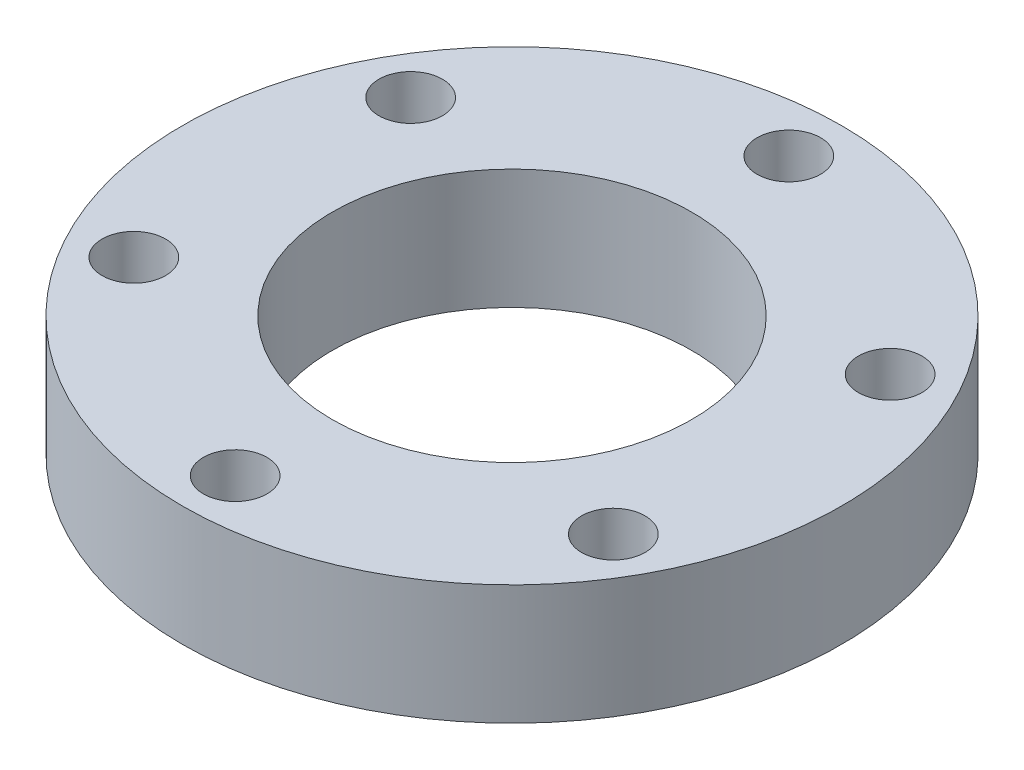
ISO-10303-21;
HEADER;
FILE_DESCRIPTION(('STEP AP214'),'2;1');
FILE_NAME('part.step','',(''),(''),'','','');
FILE_SCHEMA(('AUTOMOTIVE_DESIGN { 1 0 10303 214 1 1 1 1 }'));
ENDSEC;
DATA;
#1=APPLICATION_CONTEXT('core data for automotive mechanical design processes');
#2=APPLICATION_PROTOCOL_DEFINITION('international standard','automotive_design',2000,#1);
#3=PRODUCT_CONTEXT('',#1,'mechanical');
#4=PRODUCT('Part','Part','',(#3));
#5=PRODUCT_RELATED_PRODUCT_CATEGORY('part','',(#4));
#6=PRODUCT_DEFINITION_FORMATION('','',#4);
#7=PRODUCT_DEFINITION_CONTEXT('part definition',#1,'design');
#8=PRODUCT_DEFINITION('design','',#6,#7);
#9=PRODUCT_DEFINITION_SHAPE('','',#8);
#10=(LENGTH_UNIT() NAMED_UNIT(*) SI_UNIT(.MILLI.,.METRE.));
#11=(NAMED_UNIT(*) PLANE_ANGLE_UNIT() SI_UNIT($,.RADIAN.));
#12=(NAMED_UNIT(*) SI_UNIT($,.STERADIAN.) SOLID_ANGLE_UNIT());
#13=UNCERTAINTY_MEASURE_WITH_UNIT(LENGTH_MEASURE(1.E-05),#10,'distance_accuracy_value','');
#14=(GEOMETRIC_REPRESENTATION_CONTEXT(3) GLOBAL_UNCERTAINTY_ASSIGNED_CONTEXT((#13)) GLOBAL_UNIT_ASSIGNED_CONTEXT((#10,
#11,#12)) REPRESENTATION_CONTEXT('',''));
#15=CARTESIAN_POINT('',(0.,0.,0.));
#16=DIRECTION('',(0.,0.,1.));
#17=DIRECTION('',(1.,0.,0.));
#18=AXIS2_PLACEMENT_3D('',#15,#16,#17);
#19=CARTESIAN_POINT('',(0.,12.7,0.));
#20=DIRECTION('',(0.,1.,0.));
#21=DIRECTION('',(0.,0.,1.));
#22=AXIS2_PLACEMENT_3D('',#19,#20,#21);
#23=PLANE('',#22);
#24=CARTESIAN_POINT('',(25.4065872708242,12.7,14.6684999999998));
#25=DIRECTION('',(0.,1.,0.));
#26=DIRECTION('',(-0.866025403784443,0.,-0.499999999999992));
#27=AXIS2_PLACEMENT_3D('',#24,#25,#26);
#28=CIRCLE('',#27,3.3655);
#29=CARTESIAN_POINT('',(22.4919787743877,12.7,12.9857499999998));
#30=VERTEX_POINT('',#29);
#31=EDGE_CURVE('E68',#30,#30,#28,.T.);
#32=ORIENTED_EDGE('',*,*,#31,.F.);
#33=EDGE_LOOP('',(#32));
#34=FACE_BOUND('',#33,.T.);
#35=CARTESIAN_POINT('',(-25.406587270824,12.7,14.6685000000001));
#36=DIRECTION('',(0.,1.,0.));
#37=DIRECTION('',(0.866025403784436,0.,-0.500000000000004));
#38=AXIS2_PLACEMENT_3D('',#35,#36,#37);
#39=CIRCLE('',#38,3.3655);
#40=CARTESIAN_POINT('',(-22.4919787743875,12.7,12.9857500000001));
#41=VERTEX_POINT('',#40);
#42=EDGE_CURVE('E56',#41,#41,#39,.T.);
#43=ORIENTED_EDGE('',*,*,#42,.F.);
#44=EDGE_LOOP('',(#43));
#45=FACE_BOUND('',#44,.T.);
#46=CARTESIAN_POINT('',(0.,12.7,-29.337));
#47=DIRECTION('',(0.,1.,0.));
#48=DIRECTION('',(0.,0.,1.));
#49=AXIS2_PLACEMENT_3D('',#46,#47,#48);
#50=CIRCLE('',#49,3.3655);
#51=CARTESIAN_POINT('',(0.,12.7,-25.9715));
#52=VERTEX_POINT('',#51);
#53=EDGE_CURVE('E44',#52,#52,#50,.T.);
#54=ORIENTED_EDGE('',*,*,#53,.F.);
#55=EDGE_LOOP('',(#54));
#56=FACE_BOUND('',#55,.T.);
#57=CARTESIAN_POINT('',(0.,12.7,0.));
#58=DIRECTION('',(0.,1.,0.));
#59=DIRECTION('',(0.,0.,1.));
#60=AXIS2_PLACEMENT_3D('',#57,#58,#59);
#61=CIRCLE('',#60,34.925);
#62=CARTESIAN_POINT('',(0.,12.7,34.925));
#63=VERTEX_POINT('',#62);
#64=EDGE_CURVE('E10',#63,#63,#61,.T.);
#65=ORIENTED_EDGE('',*,*,#64,.T.);
#66=EDGE_LOOP('',(#65));
#67=FACE_BOUND('',#66,.T.);
#68=CARTESIAN_POINT('',(0.,12.7,0.));
#69=DIRECTION('',(0.,1.,0.));
#70=DIRECTION('',(0.,0.,1.));
#71=AXIS2_PLACEMENT_3D('',#68,#69,#70);
#72=CIRCLE('',#71,19.05);
#73=CARTESIAN_POINT('',(0.,12.7,19.05));
#74=VERTEX_POINT('',#73);
#75=EDGE_CURVE('E39',#74,#74,#72,.T.);
#76=ORIENTED_EDGE('',*,*,#75,.F.);
#77=EDGE_LOOP('',(#76));
#78=FACE_BOUND('',#77,.T.);
#79=CARTESIAN_POINT('',(-25.4065872708241,12.7,-14.6684999999999));
#80=DIRECTION('',(0.,1.,0.));
#81=DIRECTION('',(0.86602540378444,0.,0.499999999999998));
#82=AXIS2_PLACEMENT_3D('',#79,#80,#81);
#83=CIRCLE('',#82,3.3655);
#84=CARTESIAN_POINT('',(-22.4919787743876,12.7,-12.9857499999999));
#85=VERTEX_POINT('',#84);
#86=EDGE_CURVE('E50',#85,#85,#83,.T.);
#87=ORIENTED_EDGE('',*,*,#86,.F.);
#88=EDGE_LOOP('',(#87));
#89=FACE_BOUND('',#88,.T.);
#90=CARTESIAN_POINT('',(2.04859176075282E-13,12.7,29.337));
#91=DIRECTION('',(0.,1.,0.));
#92=DIRECTION('',(0.,0.,-1.));
#93=AXIS2_PLACEMENT_3D('',#90,#91,#92);
#94=CIRCLE('',#93,3.3655);
#95=CARTESIAN_POINT('',(1.81358015183529E-13,12.7,25.9715));
#96=VERTEX_POINT('',#95);
#97=EDGE_CURVE('E62',#96,#96,#94,.T.);
#98=ORIENTED_EDGE('',*,*,#97,.F.);
#99=EDGE_LOOP('',(#98));
#100=FACE_BOUND('',#99,.T.);
#101=CARTESIAN_POINT('',(25.4065872708239,12.7,-14.6685000000003));
#102=DIRECTION('',(0.,1.,0.));
#103=DIRECTION('',(-0.866025403784433,0.,0.50000000000001));
#104=AXIS2_PLACEMENT_3D('',#101,#102,#103);
#105=CIRCLE('',#104,3.3655);
#106=CARTESIAN_POINT('',(22.4919787743874,12.7,-12.9857500000003));
#107=VERTEX_POINT('',#106);
#108=EDGE_CURVE('E74',#107,#107,#105,.T.);
#109=ORIENTED_EDGE('',*,*,#108,.F.);
#110=EDGE_LOOP('',(#109));
#111=FACE_BOUND('',#110,.T.);
#112=ADVANCED_FACE('F28',(#34,#45,#56,#67,#78,#89,#100,#111),#23,.T.);
#113=CARTESIAN_POINT('',(0.,0.,0.));
#114=DIRECTION('',(0.,1.,0.));
#115=DIRECTION('',(0.,0.,1.));
#116=AXIS2_PLACEMENT_3D('',#113,#114,#115);
#117=PLANE('',#116);
#118=CARTESIAN_POINT('',(25.4065872708242,0.,14.6684999999998));
#119=DIRECTION('',(0.,1.,0.));
#120=DIRECTION('',(-0.866025403784443,0.,-0.499999999999992));
#121=AXIS2_PLACEMENT_3D('',#118,#119,#120);
#122=CIRCLE('',#121,3.3655);
#123=CARTESIAN_POINT('',(22.4919787743877,0.,12.9857499999998));
#124=VERTEX_POINT('',#123);
#125=EDGE_CURVE('E71',#124,#124,#122,.T.);
#126=ORIENTED_EDGE('',*,*,#125,.T.);
#127=EDGE_LOOP('',(#126));
#128=FACE_BOUND('',#127,.T.);
#129=CARTESIAN_POINT('',(-25.406587270824,0.,14.6685000000001));
#130=DIRECTION('',(0.,1.,0.));
#131=DIRECTION('',(0.866025403784436,0.,-0.500000000000004));
#132=AXIS2_PLACEMENT_3D('',#129,#130,#131);
#133=CIRCLE('',#132,3.3655);
#134=CARTESIAN_POINT('',(-22.4919787743875,0.,12.9857500000001));
#135=VERTEX_POINT('',#134);
#136=EDGE_CURVE('E59',#135,#135,#133,.T.);
#137=ORIENTED_EDGE('',*,*,#136,.T.);
#138=EDGE_LOOP('',(#137));
#139=FACE_BOUND('',#138,.T.);
#140=CARTESIAN_POINT('',(0.,0.,-29.337));
#141=DIRECTION('',(0.,1.,0.));
#142=DIRECTION('',(0.,0.,1.));
#143=AXIS2_PLACEMENT_3D('',#140,#141,#142);
#144=CIRCLE('',#143,3.3655);
#145=CARTESIAN_POINT('',(0.,0.,-25.9715));
#146=VERTEX_POINT('',#145);
#147=EDGE_CURVE('E47',#146,#146,#144,.T.);
#148=ORIENTED_EDGE('',*,*,#147,.T.);
#149=EDGE_LOOP('',(#148));
#150=FACE_BOUND('',#149,.T.);
#151=CARTESIAN_POINT('',(0.,0.,0.));
#152=DIRECTION('',(0.,1.,0.));
#153=DIRECTION('',(0.,0.,1.));
#154=AXIS2_PLACEMENT_3D('',#151,#152,#153);
#155=CIRCLE('',#154,34.925);
#156=CARTESIAN_POINT('',(0.,0.,34.925));
#157=VERTEX_POINT('',#156);
#158=EDGE_CURVE('E32',#157,#157,#155,.T.);
#159=ORIENTED_EDGE('',*,*,#158,.F.);
#160=EDGE_LOOP('',(#159));
#161=FACE_BOUND('',#160,.T.);
#162=CARTESIAN_POINT('',(0.,0.,0.));
#163=DIRECTION('',(0.,1.,0.));
#164=DIRECTION('',(0.,0.,1.));
#165=AXIS2_PLACEMENT_3D('',#162,#163,#164);
#166=CIRCLE('',#165,19.05);
#167=CARTESIAN_POINT('',(0.,0.,19.05));
#168=VERTEX_POINT('',#167);
#169=EDGE_CURVE('E41',#168,#168,#166,.T.);
#170=ORIENTED_EDGE('',*,*,#169,.T.);
#171=EDGE_LOOP('',(#170));
#172=FACE_BOUND('',#171,.T.);
#173=CARTESIAN_POINT('',(-25.4065872708241,0.,-14.6684999999999));
#174=DIRECTION('',(0.,1.,0.));
#175=DIRECTION('',(0.86602540378444,0.,0.499999999999998));
#176=AXIS2_PLACEMENT_3D('',#173,#174,#175);
#177=CIRCLE('',#176,3.3655);
#178=CARTESIAN_POINT('',(-22.4919787743876,0.,-12.9857499999999));
#179=VERTEX_POINT('',#178);
#180=EDGE_CURVE('E53',#179,#179,#177,.T.);
#181=ORIENTED_EDGE('',*,*,#180,.T.);
#182=EDGE_LOOP('',(#181));
#183=FACE_BOUND('',#182,.T.);
#184=CARTESIAN_POINT('',(2.04859176075282E-13,0.,29.337));
#185=DIRECTION('',(0.,1.,0.));
#186=DIRECTION('',(0.,0.,-1.));
#187=AXIS2_PLACEMENT_3D('',#184,#185,#186);
#188=CIRCLE('',#187,3.3655);
#189=CARTESIAN_POINT('',(1.81358015183529E-13,0.,25.9715));
#190=VERTEX_POINT('',#189);
#191=EDGE_CURVE('E65',#190,#190,#188,.T.);
#192=ORIENTED_EDGE('',*,*,#191,.T.);
#193=EDGE_LOOP('',(#192));
#194=FACE_BOUND('',#193,.T.);
#195=CARTESIAN_POINT('',(25.4065872708239,0.,-14.6685000000003));
#196=DIRECTION('',(0.,1.,0.));
#197=DIRECTION('',(-0.866025403784433,0.,0.50000000000001));
#198=AXIS2_PLACEMENT_3D('',#195,#196,#197);
#199=CIRCLE('',#198,3.3655);
#200=CARTESIAN_POINT('',(22.4919787743874,0.,-12.9857500000003));
#201=VERTEX_POINT('',#200);
#202=EDGE_CURVE('E77',#201,#201,#199,.T.);
#203=ORIENTED_EDGE('',*,*,#202,.T.);
#204=EDGE_LOOP('',(#203));
#205=FACE_BOUND('',#204,.T.);
#206=ADVANCED_FACE('F87',(#128,#139,#150,#161,#172,#183,#194,#205),#117,.F.);
#207=CARTESIAN_POINT('',(0.,12.7,0.));
#208=DIRECTION('',(0.,-1.,0.));
#209=DIRECTION('',(0.,0.,-1.));
#210=AXIS2_PLACEMENT_3D('',#207,#208,#209);
#211=CYLINDRICAL_SURFACE('',#210,34.925);
#212=ORIENTED_EDGE('',*,*,#64,.F.);
#213=EDGE_LOOP('',(#212));
#214=FACE_BOUND('',#213,.T.);
#215=ORIENTED_EDGE('',*,*,#158,.T.);
#216=EDGE_LOOP('',(#215));
#217=FACE_BOUND('',#216,.T.);
#218=ADVANCED_FACE('F30',(#214,#217),#211,.T.);
#219=CARTESIAN_POINT('',(0.,12.7,0.));
#220=DIRECTION('',(0.,-1.,0.));
#221=DIRECTION('',(0.,0.,-1.));
#222=AXIS2_PLACEMENT_3D('',#219,#220,#221);
#223=CYLINDRICAL_SURFACE('',#222,19.05);
#224=ORIENTED_EDGE('',*,*,#75,.T.);
#225=EDGE_LOOP('',(#224));
#226=FACE_BOUND('',#225,.T.);
#227=ORIENTED_EDGE('',*,*,#169,.F.);
#228=EDGE_LOOP('',(#227));
#229=FACE_BOUND('',#228,.T.);
#230=ADVANCED_FACE('F97',(#226,#229),#223,.F.);
#231=CARTESIAN_POINT('',(0.,12.7,-29.337));
#232=DIRECTION('',(0.,-1.,0.));
#233=DIRECTION('',(0.,0.,-1.));
#234=AXIS2_PLACEMENT_3D('',#231,#232,#233);
#235=CYLINDRICAL_SURFACE('',#234,3.3655);
#236=ORIENTED_EDGE('',*,*,#53,.T.);
#237=EDGE_LOOP('',(#236));
#238=FACE_BOUND('',#237,.T.);
#239=ORIENTED_EDGE('',*,*,#147,.F.);
#240=EDGE_LOOP('',(#239));
#241=FACE_BOUND('',#240,.T.);
#242=ADVANCED_FACE('F100',(#238,#241),#235,.F.);
#243=CARTESIAN_POINT('',(-25.4065872708241,12.7,-14.6684999999999));
#244=DIRECTION('',(0.,-1.,0.));
#245=DIRECTION('',(0.,0.,-1.));
#246=AXIS2_PLACEMENT_3D('',#243,#244,#245);
#247=CYLINDRICAL_SURFACE('',#246,3.3655);
#248=ORIENTED_EDGE('',*,*,#86,.T.);
#249=EDGE_LOOP('',(#248));
#250=FACE_BOUND('',#249,.T.);
#251=ORIENTED_EDGE('',*,*,#180,.F.);
#252=EDGE_LOOP('',(#251));
#253=FACE_BOUND('',#252,.T.);
#254=ADVANCED_FACE('F104',(#250,#253),#247,.F.);
#255=CARTESIAN_POINT('',(-25.406587270824,12.7,14.6685000000001));
#256=DIRECTION('',(0.,-1.,0.));
#257=DIRECTION('',(0.,0.,-1.));
#258=AXIS2_PLACEMENT_3D('',#255,#256,#257);
#259=CYLINDRICAL_SURFACE('',#258,3.3655);
#260=ORIENTED_EDGE('',*,*,#42,.T.);
#261=EDGE_LOOP('',(#260));
#262=FACE_BOUND('',#261,.T.);
#263=ORIENTED_EDGE('',*,*,#136,.F.);
#264=EDGE_LOOP('',(#263));
#265=FACE_BOUND('',#264,.T.);
#266=ADVANCED_FACE('F108',(#262,#265),#259,.F.);
#267=CARTESIAN_POINT('',(2.04859176075282E-13,12.7,29.337));
#268=DIRECTION('',(0.,-1.,0.));
#269=DIRECTION('',(0.,0.,-1.));
#270=AXIS2_PLACEMENT_3D('',#267,#268,#269);
#271=CYLINDRICAL_SURFACE('',#270,3.3655);
#272=ORIENTED_EDGE('',*,*,#97,.T.);
#273=EDGE_LOOP('',(#272));
#274=FACE_BOUND('',#273,.T.);
#275=ORIENTED_EDGE('',*,*,#191,.F.);
#276=EDGE_LOOP('',(#275));
#277=FACE_BOUND('',#276,.T.);
#278=ADVANCED_FACE('F112',(#274,#277),#271,.F.);
#279=CARTESIAN_POINT('',(25.4065872708242,12.7,14.6684999999998));
#280=DIRECTION('',(0.,-1.,0.));
#281=DIRECTION('',(0.,0.,-1.));
#282=AXIS2_PLACEMENT_3D('',#279,#280,#281);
#283=CYLINDRICAL_SURFACE('',#282,3.3655);
#284=ORIENTED_EDGE('',*,*,#31,.T.);
#285=EDGE_LOOP('',(#284));
#286=FACE_BOUND('',#285,.T.);
#287=ORIENTED_EDGE('',*,*,#125,.F.);
#288=EDGE_LOOP('',(#287));
#289=FACE_BOUND('',#288,.T.);
#290=ADVANCED_FACE('F116',(#286,#289),#283,.F.);
#291=CARTESIAN_POINT('',(25.4065872708239,12.7,-14.6685000000003));
#292=DIRECTION('',(0.,-1.,0.));
#293=DIRECTION('',(0.,0.,-1.));
#294=AXIS2_PLACEMENT_3D('',#291,#292,#293);
#295=CYLINDRICAL_SURFACE('',#294,3.3655);
#296=ORIENTED_EDGE('',*,*,#108,.T.);
#297=EDGE_LOOP('',(#296));
#298=FACE_BOUND('',#297,.T.);
#299=ORIENTED_EDGE('',*,*,#202,.F.);
#300=EDGE_LOOP('',(#299));
#301=FACE_BOUND('',#300,.T.);
#302=ADVANCED_FACE('F83',(#298,#301),#295,.F.);
#303=CLOSED_SHELL('',(#112,#206,#218,#230,#242,#254,#266,#278,#290,#302));
#304=MANIFOLD_SOLID_BREP('B2',#303);
#305=ADVANCED_BREP_SHAPE_REPRESENTATION('',(#18,#304),#14);
#306=SHAPE_DEFINITION_REPRESENTATION(#9,#305);
ENDSEC;
END-ISO-10303-21;
